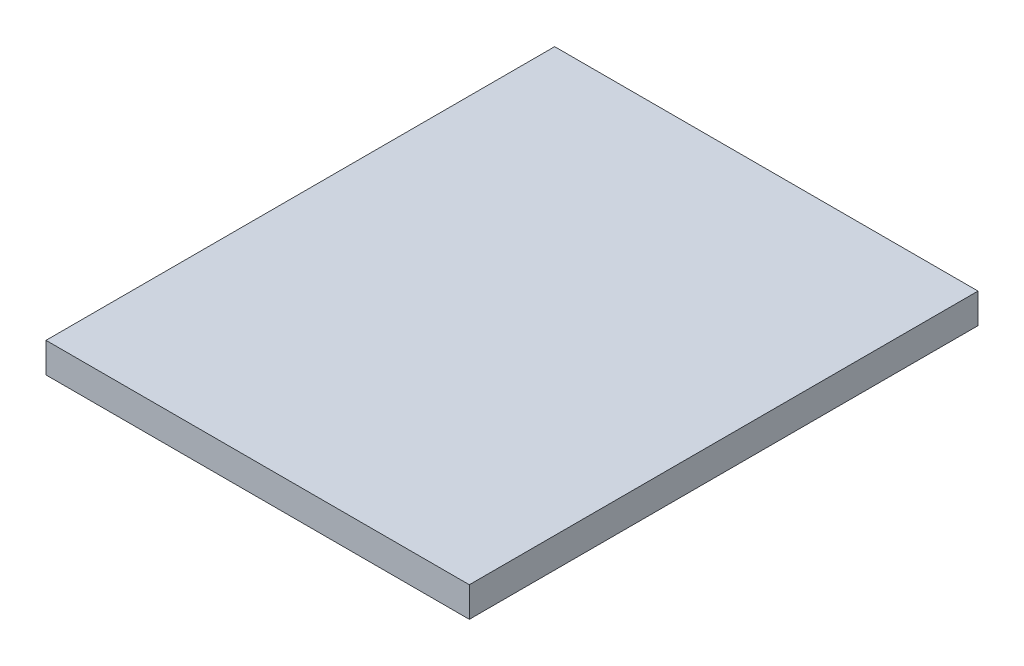
ISO-10303-21;
HEADER;
FILE_DESCRIPTION(('STEP AP214'),'2;1');
FILE_NAME('part.step','',(''),(''),'','','');
FILE_SCHEMA(('AUTOMOTIVE_DESIGN { 1 0 10303 214 1 1 1 1 }'));
ENDSEC;
DATA;
#1=APPLICATION_CONTEXT('core data for automotive mechanical design processes');
#2=APPLICATION_PROTOCOL_DEFINITION('international standard','automotive_design',2000,#1);
#3=PRODUCT_CONTEXT('',#1,'mechanical');
#4=PRODUCT('Part','Part','',(#3));
#5=PRODUCT_RELATED_PRODUCT_CATEGORY('part','',(#4));
#6=PRODUCT_DEFINITION_FORMATION('','',#4);
#7=PRODUCT_DEFINITION_CONTEXT('part definition',#1,'design');
#8=PRODUCT_DEFINITION('design','',#6,#7);
#9=PRODUCT_DEFINITION_SHAPE('','',#8);
#10=(LENGTH_UNIT() NAMED_UNIT(*) SI_UNIT(.MILLI.,.METRE.));
#11=(NAMED_UNIT(*) PLANE_ANGLE_UNIT() SI_UNIT($,.RADIAN.));
#12=(NAMED_UNIT(*) SI_UNIT($,.STERADIAN.) SOLID_ANGLE_UNIT());
#13=UNCERTAINTY_MEASURE_WITH_UNIT(LENGTH_MEASURE(1.E-05),#10,'distance_accuracy_value','');
#14=(GEOMETRIC_REPRESENTATION_CONTEXT(3) GLOBAL_UNCERTAINTY_ASSIGNED_CONTEXT((#13)) GLOBAL_UNIT_ASSIGNED_CONTEXT((#10,
#11,#12)) REPRESENTATION_CONTEXT('',''));
#15=CARTESIAN_POINT('',(0.,0.,0.));
#16=DIRECTION('',(0.,0.,1.));
#17=DIRECTION('',(1.,0.,0.));
#18=AXIS2_PLACEMENT_3D('',#15,#16,#17);
#19=CARTESIAN_POINT('',(-44.815,6.35,53.85));
#20=DIRECTION('',(1.,0.,0.));
#21=DIRECTION('',(0.,0.,-1.));
#22=AXIS2_PLACEMENT_3D('',#19,#20,#21);
#23=PLANE('',#22);
#24=DIRECTION('',(0.,0.,1.));
#25=VECTOR('',#24,1.);
#26=CARTESIAN_POINT('',(-44.815,0.,53.85));
#27=LINE('',#26,#25);
#28=CARTESIAN_POINT('',(-44.815,0.,-53.85));
#29=VERTEX_POINT('',#28);
#30=CARTESIAN_POINT('',(-44.815,0.,53.85));
#31=VERTEX_POINT('',#30);
#32=EDGE_CURVE('E111',#29,#31,#27,.T.);
#33=ORIENTED_EDGE('',*,*,#32,.T.);
#34=DIRECTION('',(0.,-1.,0.));
#35=VECTOR('',#34,1.);
#36=CARTESIAN_POINT('',(-44.815,6.35,53.85));
#37=LINE('',#36,#35);
#38=CARTESIAN_POINT('',(-44.815,6.35,53.85));
#39=VERTEX_POINT('',#38);
#40=EDGE_CURVE('E11',#39,#31,#37,.T.);
#41=ORIENTED_EDGE('',*,*,#40,.F.);
#42=DIRECTION('',(0.,0.,1.));
#43=VECTOR('',#42,1.);
#44=CARTESIAN_POINT('',(-44.815,6.35,53.85));
#45=LINE('',#44,#43);
#46=CARTESIAN_POINT('',(-44.815,6.35,-53.85));
#47=VERTEX_POINT('',#46);
#48=EDGE_CURVE('E95',#47,#39,#45,.T.);
#49=ORIENTED_EDGE('',*,*,#48,.F.);
#50=DIRECTION('',(0.,-1.,0.));
#51=VECTOR('',#50,1.);
#52=CARTESIAN_POINT('',(-44.815,6.35,-53.85));
#53=LINE('',#52,#51);
#54=EDGE_CURVE('E107',#47,#29,#53,.T.);
#55=ORIENTED_EDGE('',*,*,#54,.T.);
#56=EDGE_LOOP('',(#33,#41,#49,#55));
#57=FACE_BOUND('',#56,.T.);
#58=ADVANCED_FACE('F43',(#57),#23,.F.);
#59=CARTESIAN_POINT('',(44.815,6.35,53.85));
#60=DIRECTION('',(0.,0.,-1.));
#61=DIRECTION('',(-1.,0.,0.));
#62=AXIS2_PLACEMENT_3D('',#59,#60,#61);
#63=PLANE('',#62);
#64=DIRECTION('',(1.,0.,0.));
#65=VECTOR('',#64,1.);
#66=CARTESIAN_POINT('',(44.815,0.,53.85));
#67=LINE('',#66,#65);
#68=CARTESIAN_POINT('',(44.815,0.,53.85));
#69=VERTEX_POINT('',#68);
#70=EDGE_CURVE('E100',#31,#69,#67,.T.);
#71=ORIENTED_EDGE('',*,*,#70,.T.);
#72=DIRECTION('',(0.,-1.,0.));
#73=VECTOR('',#72,1.);
#74=CARTESIAN_POINT('',(44.815,6.35,53.85));
#75=LINE('',#74,#73);
#76=CARTESIAN_POINT('',(44.815,6.35,53.85));
#77=VERTEX_POINT('',#76);
#78=EDGE_CURVE('E52',#77,#69,#75,.T.);
#79=ORIENTED_EDGE('',*,*,#78,.F.);
#80=DIRECTION('',(1.,0.,0.));
#81=VECTOR('',#80,1.);
#82=CARTESIAN_POINT('',(44.815,6.35,53.85));
#83=LINE('',#82,#81);
#84=EDGE_CURVE('E90',#39,#77,#83,.T.);
#85=ORIENTED_EDGE('',*,*,#84,.F.);
#86=ORIENTED_EDGE('',*,*,#40,.T.);
#87=EDGE_LOOP('',(#71,#79,#85,#86));
#88=FACE_BOUND('',#87,.T.);
#89=ADVANCED_FACE('F99',(#88),#63,.F.);
#90=CARTESIAN_POINT('',(44.815,6.35,53.85));
#91=DIRECTION('',(-1.,0.,0.));
#92=DIRECTION('',(0.,0.,1.));
#93=AXIS2_PLACEMENT_3D('',#90,#91,#92);
#94=PLANE('',#93);
#95=DIRECTION('',(0.,0.,-1.));
#96=VECTOR('',#95,1.);
#97=CARTESIAN_POINT('',(44.815,0.,53.85));
#98=LINE('',#97,#96);
#99=CARTESIAN_POINT('',(44.815,0.,-53.85));
#100=VERTEX_POINT('',#99);
#101=EDGE_CURVE('E77',#69,#100,#98,.T.);
#102=ORIENTED_EDGE('',*,*,#101,.T.);
#103=DIRECTION('',(0.,-1.,0.));
#104=VECTOR('',#103,1.);
#105=CARTESIAN_POINT('',(44.815,6.35,-53.85));
#106=LINE('',#105,#104);
#107=CARTESIAN_POINT('',(44.815,6.35,-53.85));
#108=VERTEX_POINT('',#107);
#109=EDGE_CURVE('E102',#108,#100,#106,.T.);
#110=ORIENTED_EDGE('',*,*,#109,.F.);
#111=DIRECTION('',(0.,0.,-1.));
#112=VECTOR('',#111,1.);
#113=CARTESIAN_POINT('',(44.815,6.35,53.85));
#114=LINE('',#113,#112);
#115=EDGE_CURVE('E93',#77,#108,#114,.T.);
#116=ORIENTED_EDGE('',*,*,#115,.F.);
#117=ORIENTED_EDGE('',*,*,#78,.T.);
#118=EDGE_LOOP('',(#102,#110,#116,#117));
#119=FACE_BOUND('',#118,.T.);
#120=ADVANCED_FACE('F103',(#119),#94,.F.);
#121=CARTESIAN_POINT('',(44.815,6.35,-53.85));
#122=DIRECTION('',(0.,0.,1.));
#123=DIRECTION('',(1.,0.,0.));
#124=AXIS2_PLACEMENT_3D('',#121,#122,#123);
#125=PLANE('',#124);
#126=DIRECTION('',(-1.,0.,0.));
#127=VECTOR('',#126,1.);
#128=CARTESIAN_POINT('',(44.815,0.,-53.85));
#129=LINE('',#128,#127);
#130=EDGE_CURVE('E83',#100,#29,#129,.T.);
#131=ORIENTED_EDGE('',*,*,#130,.T.);
#132=ORIENTED_EDGE('',*,*,#54,.F.);
#133=DIRECTION('',(-1.,0.,0.));
#134=VECTOR('',#133,1.);
#135=CARTESIAN_POINT('',(44.815,6.35,-53.85));
#136=LINE('',#135,#134);
#137=EDGE_CURVE('E60',#108,#47,#136,.T.);
#138=ORIENTED_EDGE('',*,*,#137,.F.);
#139=ORIENTED_EDGE('',*,*,#109,.T.);
#140=EDGE_LOOP('',(#131,#132,#138,#139));
#141=FACE_BOUND('',#140,.T.);
#142=ADVANCED_FACE('F124',(#141),#125,.F.);
#143=CARTESIAN_POINT('',(0.,6.35,0.));
#144=DIRECTION('',(0.,1.,0.));
#145=DIRECTION('',(0.,0.,1.));
#146=AXIS2_PLACEMENT_3D('',#143,#144,#145);
#147=PLANE('',#146);
#148=ORIENTED_EDGE('',*,*,#48,.T.);
#149=ORIENTED_EDGE('',*,*,#84,.T.);
#150=ORIENTED_EDGE('',*,*,#115,.T.);
#151=ORIENTED_EDGE('',*,*,#137,.T.);
#152=EDGE_LOOP('',(#148,#149,#150,#151));
#153=FACE_BOUND('',#152,.T.);
#154=ADVANCED_FACE('F91',(#153),#147,.T.);
#155=CARTESIAN_POINT('',(0.,0.,0.));
#156=DIRECTION('',(0.,1.,0.));
#157=DIRECTION('',(0.,0.,1.));
#158=AXIS2_PLACEMENT_3D('',#155,#156,#157);
#159=PLANE('',#158);
#160=ORIENTED_EDGE('',*,*,#32,.F.);
#161=ORIENTED_EDGE('',*,*,#130,.F.);
#162=ORIENTED_EDGE('',*,*,#101,.F.);
#163=ORIENTED_EDGE('',*,*,#70,.F.);
#164=EDGE_LOOP('',(#160,#161,#162,#163));
#165=FACE_BOUND('',#164,.T.);
#166=ADVANCED_FACE('F127',(#165),#159,.F.);
#167=CLOSED_SHELL('',(#58,#89,#120,#142,#154,#166));
#168=MANIFOLD_SOLID_BREP('B2',#167);
#169=ADVANCED_BREP_SHAPE_REPRESENTATION('',(#18,#168),#14);
#170=SHAPE_DEFINITION_REPRESENTATION(#9,#169);
ENDSEC;
END-ISO-10303-21;
